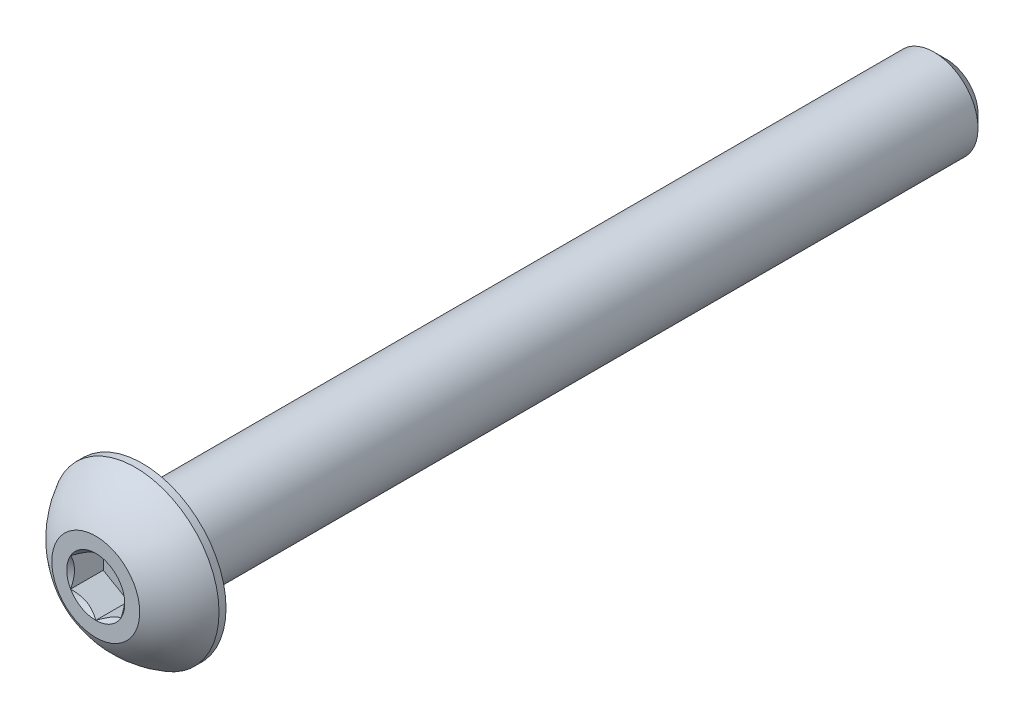
ISO-10303-21;
HEADER;
FILE_DESCRIPTION(('STEP AP214'),'2;1');
FILE_NAME('part.step','',(''),(''),'','','');
FILE_SCHEMA(('AUTOMOTIVE_DESIGN { 1 0 10303 214 1 1 1 1 }'));
ENDSEC;
DATA;
#1=APPLICATION_CONTEXT('core data for automotive mechanical design processes');
#2=APPLICATION_PROTOCOL_DEFINITION('international standard','automotive_design',2000,#1);
#3=PRODUCT_CONTEXT('',#1,'mechanical');
#4=PRODUCT('Part','Part','',(#3));
#5=PRODUCT_RELATED_PRODUCT_CATEGORY('part','',(#4));
#6=PRODUCT_DEFINITION_FORMATION('','',#4);
#7=PRODUCT_DEFINITION_CONTEXT('part definition',#1,'design');
#8=PRODUCT_DEFINITION('design','',#6,#7);
#9=PRODUCT_DEFINITION_SHAPE('','',#8);
#10=(LENGTH_UNIT() NAMED_UNIT(*) SI_UNIT(.MILLI.,.METRE.));
#11=(NAMED_UNIT(*) PLANE_ANGLE_UNIT() SI_UNIT($,.RADIAN.));
#12=(NAMED_UNIT(*) SI_UNIT($,.STERADIAN.) SOLID_ANGLE_UNIT());
#13=UNCERTAINTY_MEASURE_WITH_UNIT(LENGTH_MEASURE(1.E-05),#10,'distance_accuracy_value','');
#14=(GEOMETRIC_REPRESENTATION_CONTEXT(3) GLOBAL_UNCERTAINTY_ASSIGNED_CONTEXT((#13)) GLOBAL_UNIT_ASSIGNED_CONTEXT((#10,
#11,#12)) REPRESENTATION_CONTEXT('',''));
#15=CARTESIAN_POINT('',(0.,0.,0.));
#16=DIRECTION('',(0.,0.,1.));
#17=DIRECTION('',(1.,0.,0.));
#18=AXIS2_PLACEMENT_3D('',#15,#16,#17);
#19=CARTESIAN_POINT('',(0.,-2.0828,-40.3098));
#20=DIRECTION('',(0.,0.,-1.));
#21=DIRECTION('',(0.,1.,0.));
#22=AXIS2_PLACEMENT_3D('',#19,#20,#21);
#23=PLANE('',#22);
#24=CARTESIAN_POINT('',(0.,0.,-40.3098));
#25=DIRECTION('',(0.,0.,-1.));
#26=DIRECTION('',(0.,1.,0.));
#27=AXIS2_PLACEMENT_3D('',#24,#25,#26);
#28=CIRCLE('',#27,1.4874875);
#29=CARTESIAN_POINT('',(0.,1.4874875,-40.3098));
#30=VERTEX_POINT('',#29);
#31=EDGE_CURVE('E176',#30,#30,#28,.T.);
#32=ORIENTED_EDGE('',*,*,#31,.T.);
#33=EDGE_LOOP('',(#32));
#34=FACE_BOUND('',#33,.T.);
#35=ADVANCED_FACE('F37',(#34),#23,.T.);
#36=CARTESIAN_POINT('',(0.,0.,-40.3098));
#37=DIRECTION('',(0.,0.,-1.));
#38=DIRECTION('',(0.,1.,0.));
#39=AXIS2_PLACEMENT_3D('',#36,#37,#38);
#40=CYLINDRICAL_SURFACE('',#39,2.0828);
#41=CARTESIAN_POINT('',(0.,0.,-39.7144875));
#42=DIRECTION('',(0.,0.,-1.));
#43=DIRECTION('',(0.,1.,0.));
#44=AXIS2_PLACEMENT_3D('',#41,#42,#43);
#45=CIRCLE('',#44,2.0828);
#46=CARTESIAN_POINT('',(0.,2.0828,-39.7144875));
#47=VERTEX_POINT('',#46);
#48=EDGE_CURVE('E50',#47,#47,#45,.F.);
#49=ORIENTED_EDGE('',*,*,#48,.T.);
#50=EDGE_LOOP('',(#49));
#51=FACE_BOUND('',#50,.T.);
#52=CARTESIAN_POINT('',(0.,0.,-2.2098));
#53=DIRECTION('',(0.,0.,1.));
#54=DIRECTION('',(1.,0.,0.));
#55=AXIS2_PLACEMENT_3D('',#52,#53,#54);
#56=CIRCLE('',#55,2.0828);
#57=CARTESIAN_POINT('',(2.0828,0.,-2.2098));
#58=VERTEX_POINT('',#57);
#59=EDGE_CURVE('E173',#58,#58,#56,.F.);
#60=ORIENTED_EDGE('',*,*,#59,.T.);
#61=EDGE_LOOP('',(#60));
#62=FACE_BOUND('',#61,.T.);
#63=ADVANCED_FACE('F181',(#51,#62),#40,.T.);
#64=CARTESIAN_POINT('',(0.,0.,-40.3098));
#65=DIRECTION('',(0.,0.,1.));
#66=DIRECTION('',(0.,-1.,0.));
#67=AXIS2_PLACEMENT_3D('',#64,#65,#66);
#68=CONICAL_SURFACE('',#67,1.4874875,0.785398163397444);
#69=ORIENTED_EDGE('',*,*,#48,.F.);
#70=EDGE_LOOP('',(#69));
#71=FACE_BOUND('',#70,.T.);
#72=ORIENTED_EDGE('',*,*,#31,.F.);
#73=EDGE_LOOP('',(#72));
#74=FACE_BOUND('',#73,.T.);
#75=ADVANCED_FACE('F39',(#71,#74),#68,.T.);
#76=CARTESIAN_POINT('',(0.,0.,-3.96380867816092));
#77=DIRECTION('',(0.,0.,1.));
#78=DIRECTION('',(0.,-1.,0.));
#79=AXIS2_PLACEMENT_3D('',#76,#77,#78);
#80=SPHERICAL_SURFACE('',#79,4.47770421947049);
#81=CARTESIAN_POINT('',(0.,0.,0.));
#82=DIRECTION('',(0.,0.,1.));
#83=DIRECTION('',(1.,0.,0.));
#84=AXIS2_PLACEMENT_3D('',#81,#82,#83);
#85=CIRCLE('',#84,2.0828);
#86=CARTESIAN_POINT('',(0.,-2.0828,0.));
#87=VERTEX_POINT('',#86);
#88=EDGE_CURVE('E170',#87,#87,#85,.T.);
#89=CARTESIAN_POINT('',(0.,0.,-1.87833));
#90=DIRECTION('',(0.,0.,1.));
#91=DIRECTION('',(1.,0.,0.));
#92=AXIS2_PLACEMENT_3D('',#89,#90,#91);
#93=CIRCLE('',#92,3.9624);
#94=CARTESIAN_POINT('',(0.,-3.9624,-1.87833));
#95=VERTEX_POINT('',#94);
#96=EDGE_CURVE('E164',#95,#95,#93,.T.);
#97=CARTESIAN_POINT('',(0.,-2.0828,0.));
#98=CARTESIAN_POINT('',(0.,-2.10767763915469,-0.0130720224519118));
#99=CARTESIAN_POINT('',(0.,-2.13243218251379,-0.0263783080421214));
#100=CARTESIAN_POINT('',(0.,-2.18168637330346,-0.0534545587178047));
#101=CARTESIAN_POINT('',(0.,-2.20618602073402,-0.0672245238032785));
#102=CARTESIAN_POINT('',(0.,-2.25492171532922,-0.0952232866881573));
#103=CARTESIAN_POINT('',(0.,-2.27915776249386,-0.109452084487562));
#104=CARTESIAN_POINT('',(0.,-2.32735766987977,-0.138363459316015));
#105=CARTESIAN_POINT('',(0.,-2.35132153010104,-0.153046036345062));
#106=CARTESIAN_POINT('',(0.,-2.39896856692664,-0.18285976708332));
#107=CARTESIAN_POINT('',(0.,-2.42265174353097,-0.197990920792531));
#108=CARTESIAN_POINT('',(0.,-2.46972901769116,-0.22869644015681));
#109=CARTESIAN_POINT('',(0.,-2.49312311524702,-0.244270805811878));
#110=CARTESIAN_POINT('',(0.,-2.53961393789287,-0.275857228060144));
#111=CARTESIAN_POINT('',(0.,-2.56271066298285,-0.291869284653343));
#112=CARTESIAN_POINT('',(0.,-2.60859855282429,-0.324325412379582));
#113=CARTESIAN_POINT('',(0.,-2.63138971757574,-0.340769483512622));
#114=CARTESIAN_POINT('',(0.,-2.67665840715661,-0.37408381082988));
#115=CARTESIAN_POINT('',(0.,-2.69913593198603,-0.390954067014097));
#116=CARTESIAN_POINT('',(0.,-2.74376937333514,-0.425114783844113));
#117=CARTESIAN_POINT('',(0.,-2.76592528985483,-0.442405244489911));
#118=CARTESIAN_POINT('',(0.,-2.80990766020607,-0.477400240693378));
#119=CARTESIAN_POINT('',(0.,-2.83173411403762,-0.495104776251046));
#120=CARTESIAN_POINT('',(0.,-2.8750498214309,-0.530921645935844));
#121=CARTESIAN_POINT('',(0.,-2.89653907499262,-0.549033980062974));
#122=CARTESIAN_POINT('',(0.,-2.93917276380349,-0.585660025978065));
#123=CARTESIAN_POINT('',(0.,-2.96031719905264,-0.604173737766026));
#124=CARTESIAN_POINT('',(0.,-3.00225375543539,-0.641595975803774));
#125=CARTESIAN_POINT('',(0.,-3.02304587656898,-0.66050450205356));
#126=CARTESIAN_POINT('',(0.,-3.06427043381468,-0.698709665852367));
#127=CARTESIAN_POINT('',(0.,-3.08470286992677,-0.718006303401387));
#128=CARTESIAN_POINT('',(0.,-3.12520081373355,-0.756980849048763));
#129=CARTESIAN_POINT('',(0.,-3.14526632142825,-0.776658757147117));
#130=CARTESIAN_POINT('',(0.,-3.1850232950822,-0.816388867981036));
#131=CARTESIAN_POINT('',(0.,-3.20471476104147,-0.836441070716601));
#132=CARTESIAN_POINT('',(0.,-3.24371667050612,-0.876912662223586));
#133=CARTESIAN_POINT('',(0.,-3.2630271140115,-0.897332050995006));
#134=CARTESIAN_POINT('',(0.,-3.30126013292422,-0.938530775803146));
#135=CARTESIAN_POINT('',(0.,-3.32018270833155,-0.959310111839867));
#136=CARTESIAN_POINT('',(0.,-3.35763328290506,-1.00122136480503));
#137=CARTESIAN_POINT('',(0.,-3.37616128207125,-1.02235328173348));
#138=CARTESIAN_POINT('',(0.,-3.41281613589854,-1.06496220511693));
#139=CARTESIAN_POINT('',(0.,-3.43094299055964,-1.08643921157194));
#140=CARTESIAN_POINT('',(0.,-3.46678912932052,-1.12973070030741));
#141=CARTESIAN_POINT('',(0.,-3.4845084134203,-1.15154518258787));
#142=CARTESIAN_POINT('',(0.,-3.51953312948771,-1.19550388963656));
#143=CARTESIAN_POINT('',(0.,-3.53683856145534,-1.21764811440477));
#144=CARTESIAN_POINT('',(0.,-3.57102943840132,-1.26225845619532));
#145=CARTESIAN_POINT('',(0.,-3.58791488337967,-1.28472457321766));
#146=CARTESIAN_POINT('',(0.,-3.62125980037301,-1.32997073517287));
#147=CARTESIAN_POINT('',(0.,-3.637719272388,-1.35275078010575));
#148=CARTESIAN_POINT('',(0.,-3.67020640850626,-1.39861672224058));
#149=CARTESIAN_POINT('',(0.,-3.68623407260953,-1.42170261944253));
#150=CARTESIAN_POINT('',(0.,-3.71785191097313,-1.46817208208141));
#151=CARTESIAN_POINT('',(0.,-3.73344208523347,-1.49155564751835));
#152=CARTESIAN_POINT('',(0.,-3.76417941729919,-1.53861215694335));
#153=CARTESIAN_POINT('',(0.,-3.77932657510458,-1.56228510093141));
#154=CARTESIAN_POINT('',(0.,-3.80917250385283,-1.60991197565512));
#155=CARTESIAN_POINT('',(0.,-3.82387127479568,-1.63386590639077));
#156=CARTESIAN_POINT('',(0.,-3.85281522152763,-1.68204626145442));
#157=CARTESIAN_POINT('',(0.,-3.86706039731673,-1.70627268578243));
#158=CARTESIAN_POINT('',(0.,-3.89509209445425,-1.754989444771));
#159=CARTESIAN_POINT('',(0.,-3.90887861580268,-1.77947977943156));
#160=CARTESIAN_POINT('',(0.,-3.93598815139536,-1.8287156580258));
#161=CARTESIAN_POINT('',(0.,-3.94931116563961,-1.85346120195948));
#162=CARTESIAN_POINT('',(0.,-3.9624,-1.87833));
#163=B_SPLINE_CURVE_WITH_KNOTS('',3,(#97,#98,#99,#100,#101,#102,#103,#104,#105,#106,#107,#108,
#109,#110,#111,#112,#113,#114,#115,#116,#117,#118,#119,#120,#121,#122,#123,#124,#125,#126,#127,
#128,#129,#130,#131,#132,#133,#134,#135,#136,#137,#138,#139,#140,#141,#142,#143,#144,#145,#146,
#147,#148,#149,#150,#151,#152,#153,#154,#155,#156,#157,#158,#159,#160,#161,#162),.UNSPECIFIED.,
.F.,.F.,(4,2,2,2,2,2,2,2,2,2,2,2,2,2,2,2,2,2,2,2,2,2,2,2,2,2,2,2,2,2,2,2,4),(0.,
0.0843075442014962,0.168615088402992,0.252922632604488,0.337230176805985,0.421537721007481,
0.505845265208977,0.590152809410473,0.674460353611969,0.758767897813466,0.843075442014961,
0.927382986216458,1.01169053041795,1.09599807461945,1.18030561882095,1.26461316302244,
1.34892070722394,1.43322825142543,1.51753579562693,1.60184333982843,1.68615088402992,
1.77045842823142,1.85476597243292,1.93907351663441,2.02338106083591,2.1076886050374,
2.1919961492389,2.2763036934404,2.36061123764189,2.44491878184339,2.52922632604488,
2.61353387024638,2.69784141444788),.UNSPECIFIED.);
#164=EDGE_CURVE('BSEAM186',#87,#95,#163,.T.);
#165=ORIENTED_EDGE('',*,*,#88,.F.);
#166=ORIENTED_EDGE('',*,*,#96,.T.);
#167=ORIENTED_EDGE('',*,*,#164,.T.);
#168=ORIENTED_EDGE('',*,*,#164,.F.);
#169=EDGE_LOOP('',(#165,#167,#166,#168));
#170=FACE_BOUND('',#169,.T.);
#171=ADVANCED_FACE('F186',(#170),#80,.T.);
#172=CARTESIAN_POINT('',(0.,-2.0828,0.));
#173=DIRECTION('',(0.,0.,-1.));
#174=DIRECTION('',(-1.,0.,0.));
#175=AXIS2_PLACEMENT_3D('',#172,#173,#174);
#176=PLANE('',#175);
#177=CARTESIAN_POINT('',(0.,0.,0.));
#178=DIRECTION('',(0.,0.,1.));
#179=DIRECTION('',(1.,0.,0.));
#180=AXIS2_PLACEMENT_3D('',#177,#178,#179);
#181=CIRCLE('',#180,1.3748153285078);
#182=CARTESIAN_POINT('',(-1.190625,0.687407664253898,0.));
#183=VERTEX_POINT('',#182);
#184=CARTESIAN_POINT('',(-1.190625,-0.687407664253899,0.));
#185=VERTEX_POINT('',#184);
#186=EDGE_CURVE('E63',#183,#185,#181,.T.);
#187=ORIENTED_EDGE('',*,*,#186,.F.);
#188=CARTESIAN_POINT('',(0.,1.3748153285078,0.));
#189=VERTEX_POINT('',#188);
#190=EDGE_CURVE('E135',#189,#183,#181,.T.);
#191=ORIENTED_EDGE('',*,*,#190,.F.);
#192=CARTESIAN_POINT('',(1.190625,0.687407664253899,0.));
#193=VERTEX_POINT('',#192);
#194=EDGE_CURVE('E132',#193,#189,#181,.T.);
#195=ORIENTED_EDGE('',*,*,#194,.F.);
#196=CARTESIAN_POINT('',(1.190625,-0.687407664253899,0.));
#197=VERTEX_POINT('',#196);
#198=EDGE_CURVE('E103',#197,#193,#181,.T.);
#199=ORIENTED_EDGE('',*,*,#198,.F.);
#200=CARTESIAN_POINT('',(0.,-1.3748153285078,0.));
#201=VERTEX_POINT('',#200);
#202=EDGE_CURVE('E95',#201,#197,#181,.T.);
#203=ORIENTED_EDGE('',*,*,#202,.F.);
#204=EDGE_CURVE('E56',#185,#201,#181,.T.);
#205=ORIENTED_EDGE('',*,*,#204,.F.);
#206=EDGE_LOOP('',(#187,#191,#195,#199,#203,#205));
#207=FACE_BOUND('',#206,.T.);
#208=ORIENTED_EDGE('',*,*,#88,.T.);
#209=EDGE_LOOP('',(#208));
#210=FACE_BOUND('',#209,.T.);
#211=ADVANCED_FACE('F129',(#207,#210),#176,.F.);
#212=CARTESIAN_POINT('',(0.,-3.9624,-2.2098));
#213=DIRECTION('',(0.,0.,1.));
#214=DIRECTION('',(1.,0.,0.));
#215=AXIS2_PLACEMENT_3D('',#212,#213,#214);
#216=PLANE('',#215);
#217=ORIENTED_EDGE('',*,*,#59,.F.);
#218=EDGE_LOOP('',(#217));
#219=FACE_BOUND('',#218,.T.);
#220=CARTESIAN_POINT('',(0.,0.,-2.2098));
#221=DIRECTION('',(0.,0.,1.));
#222=DIRECTION('',(1.,0.,0.));
#223=AXIS2_PLACEMENT_3D('',#220,#221,#222);
#224=CIRCLE('',#223,3.9624);
#225=CARTESIAN_POINT('',(3.9624,0.,-2.2098));
#226=VERTEX_POINT('',#225);
#227=EDGE_CURVE('E167',#226,#226,#224,.T.);
#228=ORIENTED_EDGE('',*,*,#227,.F.);
#229=EDGE_LOOP('',(#228));
#230=FACE_BOUND('',#229,.T.);
#231=ADVANCED_FACE('F200',(#219,#230),#216,.F.);
#232=CARTESIAN_POINT('',(0.,0.,0.));
#233=DIRECTION('',(0.,0.,1.));
#234=DIRECTION('',(1.,0.,0.));
#235=AXIS2_PLACEMENT_3D('',#232,#233,#234);
#236=CYLINDRICAL_SURFACE('',#235,3.9624);
#237=ORIENTED_EDGE('',*,*,#96,.F.);
#238=EDGE_LOOP('',(#237));
#239=FACE_BOUND('',#238,.T.);
#240=ORIENTED_EDGE('',*,*,#227,.T.);
#241=EDGE_LOOP('',(#240));
#242=FACE_BOUND('',#241,.T.);
#243=ADVANCED_FACE('F203',(#239,#242),#236,.T.);
#244=CARTESIAN_POINT('',(0.,0.,0.));
#245=DIRECTION('',(0.,0.,1.));
#246=DIRECTION('',(1.,0.,0.));
#247=AXIS2_PLACEMENT_3D('',#244,#245,#246);
#248=CONICAL_SURFACE('',#247,1.3748153285078,0.78539816339745);
#249=ORIENTED_EDGE('',*,*,#198,.T.);
#250=CARTESIAN_POINT('',(1.190625,-1.37097145294693,0.44099044728994));
#251=CARTESIAN_POINT('',(1.190625,-1.3375892063789,0.415789988807826));
#252=CARTESIAN_POINT('',(1.190625,-1.30402095496658,0.39083662023745));
#253=CARTESIAN_POINT('',(1.190625,-1.23643692297761,0.341526087177203));
#254=CARTESIAN_POINT('',(1.190625,-1.20242103219112,0.317169073899369));
#255=CARTESIAN_POINT('',(1.190625,-1.09909081482554,0.244798208989214));
#256=CARTESIAN_POINT('',(1.190625,-1.02900143506767,0.197872622595561));
#257=CARTESIAN_POINT('',(1.190625,-0.882026737424228,0.105752103325632));
#258=CARTESIAN_POINT('',(1.190625,-0.80498186601998,0.0608088372420604));
#259=CARTESIAN_POINT('',(1.190625,-0.647043893307964,-0.0214019754931318));
#260=CARTESIAN_POINT('',(1.190625,-0.56616494370292,-0.058695398267878));
#261=CARTESIAN_POINT('',(1.190625,-0.444764933868855,-0.104320444436902));
#262=CARTESIAN_POINT('',(1.190625,-0.406041211486712,-0.117415160978515));
#263=CARTESIAN_POINT('',(1.190625,-0.327658904711932,-0.140495724103359));
#264=CARTESIAN_POINT('',(1.190625,-0.288000256118251,-0.150481356514043));
#265=CARTESIAN_POINT('',(1.190625,-0.208647693212096,-0.166658770934747));
#266=CARTESIAN_POINT('',(1.190625,-0.168967240621961,-0.172915554151022));
#267=CARTESIAN_POINT('',(1.190625,-0.0891819742965327,-0.181513111581485));
#268=CARTESIAN_POINT('',(1.190625,-0.0490772347013119,-0.183854558950103));
#269=CARTESIAN_POINT('',(1.190625,0.0297075773931769,-0.184447755932347));
#270=CARTESIAN_POINT('',(1.190625,0.068386606828809,-0.182844646203951));
#271=CARTESIAN_POINT('',(1.190625,0.14541687663315,-0.175956972255488));
#272=CARTESIAN_POINT('',(1.190625,0.183768052740679,-0.170671702331516));
#273=CARTESIAN_POINT('',(1.190625,0.260508634904944,-0.156618587767133));
#274=CARTESIAN_POINT('',(1.190625,0.298887052039132,-0.14779163739419));
#275=CARTESIAN_POINT('',(1.190625,0.374805334250663,-0.127124290019378));
#276=CARTESIAN_POINT('',(1.190625,0.412345269207094,-0.115284145164061));
#277=CARTESIAN_POINT('',(1.190625,0.530535580908839,-0.0735526663328066));
#278=CARTESIAN_POINT('',(1.190625,0.609503725744447,-0.0389086030856526));
#279=CARTESIAN_POINT('',(1.190625,0.763730269113466,0.0381182519748632));
#280=CARTESIAN_POINT('',(1.190625,0.838974064674605,0.0805288466686658));
#281=CARTESIAN_POINT('',(1.190625,0.982775796189618,0.168025645024959));
#282=CARTESIAN_POINT('',(1.190625,1.05148016607044,0.212874162055227));
#283=CARTESIAN_POINT('',(1.190625,1.15270222256253,0.282205329922607));
#284=CARTESIAN_POINT('',(1.190625,1.18600604145834,0.305560176337173));
#285=CARTESIAN_POINT('',(1.190625,1.25215860362232,0.35288756901931));
#286=CARTESIAN_POINT('',(1.190625,1.28500746868279,0.376859944858282));
#287=CARTESIAN_POINT('',(1.190625,1.31766689427973,0.401088366771255));
#288=B_SPLINE_CURVE_WITH_KNOTS('',3,(#250,#251,#252,#253,#254,#255,#256,#257,#258,#259,#260,
#261,#262,#263,#264,#265,#266,#267,#268,#269,#270,#271,#272,#273,#274,#275,#276,#277,#278,#279,
#280,#281,#282,#283,#284,#285,#286,#287),.UNSPECIFIED.,.F.,.F.,(4,2,2,2,2,2,2,2,2,2,2,2,2,2,2,2,
2,2,4),(0.,0.125475644763329,0.250982782413966,0.503912518769173,0.771279184643224,
1.03772598255657,1.16025581644629,1.28279408906665,1.40312855503246,1.5234423300503,
1.63939577664877,1.75537145240477,1.87336894094838,1.99135655861152,2.24929724983449,
2.50818004711563,2.75419821472196,2.87622362118596,2.99821570388961),.UNSPECIFIED.);
#289=EDGE_CURVE('E11',#197,#193,#288,.T.);
#290=ORIENTED_EDGE('',*,*,#289,.F.);
#291=EDGE_LOOP('',(#249,#290));
#292=FACE_BOUND('',#291,.T.);
#293=ADVANCED_FACE('F107',(#292),#248,.F.);
#294=ORIENTED_EDGE('',*,*,#194,.T.);
#295=CARTESIAN_POINT('',(1.190825,0.68729219420006,0.000115484600023907));
#296=CARTESIAN_POINT('',(1.14989058041014,0.710925692369385,-0.0235012357857369));
#297=CARTESIAN_POINT('',(1.10827161169803,0.734954415158721,-0.0457312182768795));
#298=CARTESIAN_POINT('',(1.02340555632637,0.783951855072609,-0.0864343373725631));
#299=CARTESIAN_POINT('',(0.980150392709039,0.808925235430915,-0.104884817352449));
#300=CARTESIAN_POINT('',(0.892928352542576,0.859282903800291,-0.136491161995679));
#301=CARTESIAN_POINT('',(0.848983705042075,0.884654357864149,-0.149726495756684));
#302=CARTESIAN_POINT('',(0.760126625836306,0.935956016463003,-0.170118548424605));
#303=CARTESIAN_POINT('',(0.715216911165245,0.96188465231757,-0.177290497104008));
#304=CARTESIAN_POINT('',(0.637820872343022,1.00656927616579,-0.183761461351144));
#305=CARTESIAN_POINT('',(0.605434587484353,1.025267506447,-0.18471967985321));
#306=CARTESIAN_POINT('',(0.54071892668223,1.06263111063189,-0.183107350927916));
#307=CARTESIAN_POINT('',(0.508389564872727,1.08129647637533,-0.180536024820421));
#308=CARTESIAN_POINT('',(0.444042843928515,1.11844707303394,-0.172013246006379));
#309=CARTESIAN_POINT('',(0.412025803663232,1.13693211984976,-0.166058645247436));
#310=CARTESIAN_POINT('',(0.348526236603543,1.17359361198509,-0.1510900359288));
#311=CARTESIAN_POINT('',(0.317043945355836,1.19176992131166,-0.142074714087946));
#312=CARTESIAN_POINT('',(0.236410161427873,1.23832385816825,-0.115317704161983));
#313=CARTESIAN_POINT('',(0.187767164732342,1.26640790540461,-0.0955631855639916));
#314=CARTESIAN_POINT('',(0.0923855836478807,1.32147648691945,-0.0510632310423197));
#315=CARTESIAN_POINT('',(0.0456413824128441,1.34846426408555,-0.026334035283841));
#316=CARTESIAN_POINT('',(-0.000200000000000358,1.37493079856163,0.000115484600024344));
#317=B_SPLINE_CURVE_WITH_KNOTS('',3,(#295,#296,#297,#298,#299,#300,#301,#302,#303,#304,#305,
#306,#307,#308,#309,#310,#311,#312,#313,#314,#315,#316),.UNSPECIFIED.,.F.,.F.,(4,2,2,2,2,2,2,2,
2,2,4),(0.,0.15862567293412,0.318176079843271,0.475191357500655,0.631811068630749,
0.743878551794718,0.855970763007029,0.968167444423242,1.08041232768377,1.25873351645467,
1.43648174479847),.UNSPECIFIED.);
#318=EDGE_CURVE('E134',#193,#189,#317,.T.);
#319=ORIENTED_EDGE('',*,*,#318,.F.);
#320=EDGE_LOOP('',(#294,#319));
#321=FACE_BOUND('',#320,.T.);
#322=ADVANCED_FACE('F283',(#321),#248,.F.);
#323=ORIENTED_EDGE('',*,*,#190,.T.);
#324=CARTESIAN_POINT('',(0.000199999999999495,1.37493079856163,0.000115484600024211));
#325=CARTESIAN_POINT('',(-0.0407344195898567,1.35129730039231,-0.0235012357857363));
#326=CARTESIAN_POINT('',(-0.0823533883019742,1.32726857760297,-0.045731218276879));
#327=CARTESIAN_POINT('',(-0.167219443673633,1.27827113768909,-0.0864343373725627));
#328=CARTESIAN_POINT('',(-0.210474607290961,1.25329775733078,-0.104884817352448));
#329=CARTESIAN_POINT('',(-0.297696647457424,1.2029400889614,-0.136491161995679));
#330=CARTESIAN_POINT('',(-0.341641294957925,1.17756863489755,-0.149726495756683));
#331=CARTESIAN_POINT('',(-0.430498374163694,1.12626697629869,-0.170118548424605));
#332=CARTESIAN_POINT('',(-0.475408088834755,1.10033834044413,-0.177290497104008));
#333=CARTESIAN_POINT('',(-0.552804127656978,1.0556537165959,-0.183761461351144));
#334=CARTESIAN_POINT('',(-0.585190412515646,1.0369554863147,-0.18471967985321));
#335=CARTESIAN_POINT('',(-0.64990607331777,0.99959188212981,-0.183107350927916));
#336=CARTESIAN_POINT('',(-0.682235435127272,0.980926516386364,-0.180536024820421));
#337=CARTESIAN_POINT('',(-0.746582156071484,0.943775919727754,-0.172013246006379));
#338=CARTESIAN_POINT('',(-0.778599196336768,0.925290872911937,-0.166058645247436));
#339=CARTESIAN_POINT('',(-0.842098763396457,0.888629380776601,-0.1510900359288));
#340=CARTESIAN_POINT('',(-0.873581054644164,0.870453071450031,-0.142074714087946));
#341=CARTESIAN_POINT('',(-0.954214838572126,0.823899134593444,-0.115317704161984));
#342=CARTESIAN_POINT('',(-1.00285783526766,0.795815087357089,-0.0955631855639919));
#343=CARTESIAN_POINT('',(-1.09823941635212,0.740746505842243,-0.0510632310423202));
#344=CARTESIAN_POINT('',(-1.14498361758716,0.713758728676141,-0.0263340352838417));
#345=CARTESIAN_POINT('',(-1.190825,0.68729219420006,0.000115484600023614));
#346=B_SPLINE_CURVE_WITH_KNOTS('',3,(#324,#325,#326,#327,#328,#329,#330,#331,#332,#333,#334,
#335,#336,#337,#338,#339,#340,#341,#342,#343,#344,#345),.UNSPECIFIED.,.F.,.F.,(4,2,2,2,2,2,2,2,
2,2,4),(0.,0.15862567293412,0.318176079843271,0.475191357500655,0.631811068630748,
0.743878551794718,0.855970763007028,0.968167444423241,1.08041232768376,1.25873351645467,
1.43648174479847),.UNSPECIFIED.);
#347=EDGE_CURVE('E139',#189,#183,#346,.T.);
#348=ORIENTED_EDGE('',*,*,#347,.F.);
#349=EDGE_LOOP('',(#323,#348));
#350=FACE_BOUND('',#349,.T.);
#351=ADVANCED_FACE('F142',(#350),#248,.F.);
#352=ORIENTED_EDGE('',*,*,#186,.T.);
#353=CARTESIAN_POINT('',(-1.190625,-1.37097145294693,0.440990447289941));
#354=CARTESIAN_POINT('',(-1.190625,-1.3375892063789,0.415789988807826));
#355=CARTESIAN_POINT('',(-1.190625,-1.30402095496658,0.39083662023745));
#356=CARTESIAN_POINT('',(-1.190625,-1.23643692297761,0.341526087177203));
#357=CARTESIAN_POINT('',(-1.190625,-1.20242103219112,0.317169073899369));
#358=CARTESIAN_POINT('',(-1.190625,-1.09909081482554,0.244798208989214));
#359=CARTESIAN_POINT('',(-1.190625,-1.02900143506767,0.197872622595562));
#360=CARTESIAN_POINT('',(-1.190625,-0.882026737424229,0.105752103325632));
#361=CARTESIAN_POINT('',(-1.190625,-0.80498186601998,0.0608088372420604));
#362=CARTESIAN_POINT('',(-1.190625,-0.647043893307964,-0.0214019754931318));
#363=CARTESIAN_POINT('',(-1.190625,-0.56616494370292,-0.0586953982678779));
#364=CARTESIAN_POINT('',(-1.190625,-0.444764933868855,-0.104320444436902));
#365=CARTESIAN_POINT('',(-1.190625,-0.406041211486713,-0.117415160978515));
#366=CARTESIAN_POINT('',(-1.190625,-0.327658904711932,-0.140495724103359));
#367=CARTESIAN_POINT('',(-1.190625,-0.288000256118252,-0.150481356514043));
#368=CARTESIAN_POINT('',(-1.190625,-0.208647693212096,-0.166658770934748));
#369=CARTESIAN_POINT('',(-1.190625,-0.168967240621961,-0.172915554151022));
#370=CARTESIAN_POINT('',(-1.190625,-0.0891819742965331,-0.181513111581485));
#371=CARTESIAN_POINT('',(-1.190625,-0.0490772347013122,-0.183854558950103));
#372=CARTESIAN_POINT('',(-1.190625,0.0297075773931766,-0.184447755932347));
#373=CARTESIAN_POINT('',(-1.190625,0.0683866068288087,-0.182844646203951));
#374=CARTESIAN_POINT('',(-1.190625,0.14541687663315,-0.175956972255488));
#375=CARTESIAN_POINT('',(-1.190625,0.183768052740679,-0.170671702331516));
#376=CARTESIAN_POINT('',(-1.190625,0.260508634904944,-0.156618587767133));
#377=CARTESIAN_POINT('',(-1.190625,0.298887052039132,-0.147791637394191));
#378=CARTESIAN_POINT('',(-1.190625,0.374805334250663,-0.127124290019378));
#379=CARTESIAN_POINT('',(-1.190625,0.412345269207094,-0.115284145164062));
#380=CARTESIAN_POINT('',(-1.190625,0.530535580908839,-0.0735526663328068));
#381=CARTESIAN_POINT('',(-1.190625,0.609503725744447,-0.0389086030856529));
#382=CARTESIAN_POINT('',(-1.190625,0.763730269113466,0.0381182519748631));
#383=CARTESIAN_POINT('',(-1.190625,0.838974064674605,0.0805288466686658));
#384=CARTESIAN_POINT('',(-1.190625,0.982775796189618,0.168025645024959));
#385=CARTESIAN_POINT('',(-1.190625,1.05148016607044,0.212874162055227));
#386=CARTESIAN_POINT('',(-1.190625,1.15270222256253,0.282205329922607));
#387=CARTESIAN_POINT('',(-1.190625,1.18600604145834,0.305560176337173));
#388=CARTESIAN_POINT('',(-1.190625,1.25215860362232,0.35288756901931));
#389=CARTESIAN_POINT('',(-1.190625,1.28500746868279,0.376859944858282));
#390=CARTESIAN_POINT('',(-1.190625,1.31766689427973,0.401088366771255));
#391=B_SPLINE_CURVE_WITH_KNOTS('',3,(#353,#354,#355,#356,#357,#358,#359,#360,#361,#362,#363,
#364,#365,#366,#367,#368,#369,#370,#371,#372,#373,#374,#375,#376,#377,#378,#379,#380,#381,#382,
#383,#384,#385,#386,#387,#388,#389,#390),.UNSPECIFIED.,.F.,.F.,(4,2,2,2,2,2,2,2,2,2,2,2,2,2,2,2,
2,2,4),(0.,0.125475644763329,0.250982782413966,0.503912518769173,0.771279184643224,
1.03772598255657,1.16025581644629,1.28279408906665,1.40312855503246,1.5234423300503,
1.63939577664877,1.75537145240477,1.87336894094838,1.99135655861152,2.24929724983449,
2.50818004711563,2.75419821472196,2.87622362118597,2.99821570388961),.UNSPECIFIED.);
#392=EDGE_CURVE('E146',#183,#185,#391,.F.);
#393=ORIENTED_EDGE('',*,*,#392,.F.);
#394=EDGE_LOOP('',(#352,#393));
#395=FACE_BOUND('',#394,.T.);
#396=ADVANCED_FACE('F277',(#395),#248,.F.);
#397=ORIENTED_EDGE('',*,*,#204,.T.);
#398=CARTESIAN_POINT('',(-1.190825,-0.687292194200061,0.000115484600023906));
#399=CARTESIAN_POINT('',(-1.14989058041014,-0.710925692369385,-0.0235012357857368));
#400=CARTESIAN_POINT('',(-1.10827161169803,-0.734954415158721,-0.0457312182768794));
#401=CARTESIAN_POINT('',(-1.02340555632637,-0.783951855072609,-0.086434337372563));
#402=CARTESIAN_POINT('',(-0.980150392709039,-0.808925235430915,-0.104884817352449));
#403=CARTESIAN_POINT('',(-0.892928352542576,-0.859282903800291,-0.136491161995679));
#404=CARTESIAN_POINT('',(-0.848983705042075,-0.884654357864149,-0.149726495756684));
#405=CARTESIAN_POINT('',(-0.760126625836306,-0.935956016463003,-0.170118548424605));
#406=CARTESIAN_POINT('',(-0.715216911165245,-0.961884652317569,-0.177290497104008));
#407=CARTESIAN_POINT('',(-0.637820872343022,-1.00656927616579,-0.183761461351144));
#408=CARTESIAN_POINT('',(-0.605434587484353,-1.02526750644699,-0.18471967985321));
#409=CARTESIAN_POINT('',(-0.54071892668223,-1.06263111063189,-0.183107350927916));
#410=CARTESIAN_POINT('',(-0.508389564872727,-1.08129647637533,-0.180536024820421));
#411=CARTESIAN_POINT('',(-0.444042843928515,-1.11844707303394,-0.172013246006379));
#412=CARTESIAN_POINT('',(-0.412025803663232,-1.13693211984976,-0.166058645247436));
#413=CARTESIAN_POINT('',(-0.348526236603543,-1.17359361198509,-0.1510900359288));
#414=CARTESIAN_POINT('',(-0.317043945355836,-1.19176992131166,-0.142074714087946));
#415=CARTESIAN_POINT('',(-0.236410161427873,-1.23832385816825,-0.115317704161983));
#416=CARTESIAN_POINT('',(-0.187767164732342,-1.26640790540461,-0.0955631855639916));
#417=CARTESIAN_POINT('',(-0.0923855836478808,-1.32147648691945,-0.0510632310423198));
#418=CARTESIAN_POINT('',(-0.0456413824128442,-1.34846426408555,-0.0263340352838412));
#419=CARTESIAN_POINT('',(0.000200000000000431,-1.37493079856163,0.000115484600024223));
#420=B_SPLINE_CURVE_WITH_KNOTS('',3,(#398,#399,#400,#401,#402,#403,#404,#405,#406,#407,#408,
#409,#410,#411,#412,#413,#414,#415,#416,#417,#418,#419),.UNSPECIFIED.,.F.,.F.,(4,2,2,2,2,2,2,2,
2,2,4),(0.,0.15862567293412,0.318176079843271,0.475191357500655,0.631811068630748,
0.743878551794718,0.855970763007029,0.968167444423241,1.08041232768377,1.25873351645467,
1.43648174479847),.UNSPECIFIED.);
#421=EDGE_CURVE('E119',#185,#201,#420,.T.);
#422=ORIENTED_EDGE('',*,*,#421,.F.);
#423=EDGE_LOOP('',(#397,#422));
#424=FACE_BOUND('',#423,.T.);
#425=ADVANCED_FACE('F228',(#424),#248,.F.);
#426=ORIENTED_EDGE('',*,*,#202,.T.);
#427=CARTESIAN_POINT('',(-0.000199999999999412,-1.37493079856163,0.000115484600024211));
#428=CARTESIAN_POINT('',(0.0407344195898569,-1.35129730039231,-0.0235012357857364));
#429=CARTESIAN_POINT('',(0.0823533883019744,-1.32726857760297,-0.045731218276879));
#430=CARTESIAN_POINT('',(0.167219443673633,-1.27827113768909,-0.0864343373725627));
#431=CARTESIAN_POINT('',(0.210474607290961,-1.25329775733078,-0.104884817352448));
#432=CARTESIAN_POINT('',(0.297696647457424,-1.2029400889614,-0.136491161995679));
#433=CARTESIAN_POINT('',(0.341641294957925,-1.17756863489755,-0.149726495756684));
#434=CARTESIAN_POINT('',(0.430498374163694,-1.12626697629869,-0.170118548424605));
#435=CARTESIAN_POINT('',(0.475408088834755,-1.10033834044413,-0.177290497104008));
#436=CARTESIAN_POINT('',(0.552804127656978,-1.0556537165959,-0.183761461351144));
#437=CARTESIAN_POINT('',(0.585190412515647,-1.0369554863147,-0.18471967985321));
#438=CARTESIAN_POINT('',(0.64990607331777,-0.99959188212981,-0.183107350927916));
#439=CARTESIAN_POINT('',(0.682235435127273,-0.980926516386364,-0.180536024820421));
#440=CARTESIAN_POINT('',(0.746582156071485,-0.943775919727753,-0.172013246006379));
#441=CARTESIAN_POINT('',(0.778599196336768,-0.925290872911937,-0.166058645247436));
#442=CARTESIAN_POINT('',(0.842098763396457,-0.888629380776601,-0.1510900359288));
#443=CARTESIAN_POINT('',(0.873581054644164,-0.870453071450031,-0.142074714087946));
#444=CARTESIAN_POINT('',(0.954214838572127,-0.823899134593444,-0.115317704161983));
#445=CARTESIAN_POINT('',(1.00285783526766,-0.795815087357089,-0.0955631855639918));
#446=CARTESIAN_POINT('',(1.09823941635212,-0.740746505842243,-0.0510632310423199));
#447=CARTESIAN_POINT('',(1.14498361758716,-0.713758728676141,-0.0263340352838413));
#448=CARTESIAN_POINT('',(1.190825,-0.68729219420006,0.00011548460002403));
#449=B_SPLINE_CURVE_WITH_KNOTS('',3,(#427,#428,#429,#430,#431,#432,#433,#434,#435,#436,#437,
#438,#439,#440,#441,#442,#443,#444,#445,#446,#447,#448),.UNSPECIFIED.,.F.,.F.,(4,2,2,2,2,2,2,2,
2,2,4),(0.,0.15862567293412,0.318176079843271,0.475191357500655,0.631811068630748,
0.743878551794718,0.855970763007029,0.968167444423242,1.08041232768377,1.25873351645467,
1.43648174479847),.UNSPECIFIED.);
#450=EDGE_CURVE('E99',#201,#197,#449,.T.);
#451=ORIENTED_EDGE('',*,*,#450,.F.);
#452=EDGE_LOOP('',(#426,#451));
#453=FACE_BOUND('',#452,.T.);
#454=ADVANCED_FACE('F97',(#453),#248,.F.);
#455=CARTESIAN_POINT('',(1.190625,-0.687407664253898,-1.54686));
#456=DIRECTION('',(0.,0.,1.));
#457=DIRECTION('',(1.,0.,0.));
#458=AXIS2_PLACEMENT_3D('',#455,#456,#457);
#459=PLANE('',#458);
#460=DIRECTION('',(0.866025403784438,0.5,0.));
#461=VECTOR('',#460,1.);
#462=CARTESIAN_POINT('',(0.,-1.3748153285078,-1.54686));
#463=LINE('',#462,#461);
#464=CARTESIAN_POINT('',(0.,-1.3748153285078,-1.54686));
#465=VERTEX_POINT('',#464);
#466=CARTESIAN_POINT('',(1.190625,-0.687407664253898,-1.54686));
#467=VERTEX_POINT('',#466);
#468=EDGE_CURVE('E118',#465,#467,#463,.T.);
#469=ORIENTED_EDGE('',*,*,#468,.T.);
#470=DIRECTION('',(0.,1.,0.));
#471=VECTOR('',#470,1.);
#472=CARTESIAN_POINT('',(1.190625,-0.687407664253898,-1.54686));
#473=LINE('',#472,#471);
#474=CARTESIAN_POINT('',(1.190625,0.687407664253898,-1.54686));
#475=VERTEX_POINT('',#474);
#476=EDGE_CURVE('E123',#467,#475,#473,.T.);
#477=ORIENTED_EDGE('',*,*,#476,.T.);
#478=DIRECTION('',(-0.866025403784439,0.5,0.));
#479=VECTOR('',#478,1.);
#480=CARTESIAN_POINT('',(1.190625,0.687407664253898,-1.54686));
#481=LINE('',#480,#479);
#482=CARTESIAN_POINT('',(0.,1.3748153285078,-1.54686));
#483=VERTEX_POINT('',#482);
#484=EDGE_CURVE('E267',#475,#483,#481,.T.);
#485=ORIENTED_EDGE('',*,*,#484,.T.);
#486=DIRECTION('',(-0.866025403784438,-0.5,0.));
#487=VECTOR('',#486,1.);
#488=CARTESIAN_POINT('',(0.,1.3748153285078,-1.54686));
#489=LINE('',#488,#487);
#490=CARTESIAN_POINT('',(-1.190625,0.687407664253898,-1.54686));
#491=VERTEX_POINT('',#490);
#492=EDGE_CURVE('E155',#483,#491,#489,.T.);
#493=ORIENTED_EDGE('',*,*,#492,.T.);
#494=DIRECTION('',(0.,-1.,0.));
#495=VECTOR('',#494,1.);
#496=CARTESIAN_POINT('',(-1.190625,0.687407664253898,-1.54686));
#497=LINE('',#496,#495);
#498=CARTESIAN_POINT('',(-1.190625,-0.687407664253898,-1.54686));
#499=VERTEX_POINT('',#498);
#500=EDGE_CURVE('E271',#491,#499,#497,.T.);
#501=ORIENTED_EDGE('',*,*,#500,.T.);
#502=DIRECTION('',(0.866025403784439,-0.5,0.));
#503=VECTOR('',#502,1.);
#504=CARTESIAN_POINT('',(-1.190625,-0.687407664253898,-1.54686));
#505=LINE('',#504,#503);
#506=EDGE_CURVE('E126',#499,#465,#505,.T.);
#507=ORIENTED_EDGE('',*,*,#506,.T.);
#508=EDGE_LOOP('',(#469,#477,#485,#493,#501,#507));
#509=FACE_BOUND('',#508,.T.);
#510=ADVANCED_FACE('F227',(#509),#459,.T.);
#511=CARTESIAN_POINT('',(1.190625,-0.687407664253898,-1.54686));
#512=DIRECTION('',(1.,0.,0.));
#513=DIRECTION('',(0.,0.,-1.));
#514=AXIS2_PLACEMENT_3D('',#511,#512,#513);
#515=PLANE('',#514);
#516=DIRECTION('',(0.,0.,1.));
#517=VECTOR('',#516,1.);
#518=CARTESIAN_POINT('',(1.190625,-0.687407664253898,-1.54686));
#519=LINE('',#518,#517);
#520=EDGE_CURVE('E115',#467,#197,#519,.T.);
#521=ORIENTED_EDGE('',*,*,#520,.T.);
#522=ORIENTED_EDGE('',*,*,#289,.T.);
#523=DIRECTION('',(0.,0.,1.));
#524=VECTOR('',#523,1.);
#525=CARTESIAN_POINT('',(1.190625,0.687407664253898,-1.54686));
#526=LINE('',#525,#524);
#527=EDGE_CURVE('E125',#475,#193,#526,.T.);
#528=ORIENTED_EDGE('',*,*,#527,.F.);
#529=ORIENTED_EDGE('',*,*,#476,.F.);
#530=EDGE_LOOP('',(#521,#522,#528,#529));
#531=FACE_BOUND('',#530,.T.);
#532=ADVANCED_FACE('F121',(#531),#515,.F.);
#533=CARTESIAN_POINT('',(1.190625,0.687407664253898,-1.54686));
#534=DIRECTION('',(0.5,0.866025403784439,0.));
#535=DIRECTION('',(-0.866025403784439,0.5,0.));
#536=AXIS2_PLACEMENT_3D('',#533,#534,#535);
#537=PLANE('',#536);
#538=ORIENTED_EDGE('',*,*,#527,.T.);
#539=ORIENTED_EDGE('',*,*,#318,.T.);
#540=DIRECTION('',(0.,0.,1.));
#541=VECTOR('',#540,1.);
#542=CARTESIAN_POINT('',(0.,1.3748153285078,-1.54686));
#543=LINE('',#542,#541);
#544=EDGE_CURVE('E151',#483,#189,#543,.T.);
#545=ORIENTED_EDGE('',*,*,#544,.F.);
#546=ORIENTED_EDGE('',*,*,#484,.F.);
#547=EDGE_LOOP('',(#538,#539,#545,#546));
#548=FACE_BOUND('',#547,.T.);
#549=ADVANCED_FACE('F149',(#548),#537,.F.);
#550=CARTESIAN_POINT('',(0.,1.3748153285078,-1.54686));
#551=DIRECTION('',(-0.5,0.866025403784438,0.));
#552=DIRECTION('',(-0.866025403784438,-0.5,0.));
#553=AXIS2_PLACEMENT_3D('',#550,#551,#552);
#554=PLANE('',#553);
#555=ORIENTED_EDGE('',*,*,#544,.T.);
#556=ORIENTED_EDGE('',*,*,#347,.T.);
#557=DIRECTION('',(0.,0.,1.));
#558=VECTOR('',#557,1.);
#559=CARTESIAN_POINT('',(-1.190625,0.687407664253898,-1.54686));
#560=LINE('',#559,#558);
#561=EDGE_CURVE('E157',#491,#183,#560,.T.);
#562=ORIENTED_EDGE('',*,*,#561,.F.);
#563=ORIENTED_EDGE('',*,*,#492,.F.);
#564=EDGE_LOOP('',(#555,#556,#562,#563));
#565=FACE_BOUND('',#564,.T.);
#566=ADVANCED_FACE('F153',(#565),#554,.F.);
#567=CARTESIAN_POINT('',(-1.190625,0.687407664253898,-1.54686));
#568=DIRECTION('',(-1.,0.,0.));
#569=DIRECTION('',(0.,0.,1.));
#570=AXIS2_PLACEMENT_3D('',#567,#568,#569);
#571=PLANE('',#570);
#572=ORIENTED_EDGE('',*,*,#561,.T.);
#573=ORIENTED_EDGE('',*,*,#392,.T.);
#574=DIRECTION('',(0.,0.,1.));
#575=VECTOR('',#574,1.);
#576=CARTESIAN_POINT('',(-1.190625,-0.687407664253898,-1.54686));
#577=LINE('',#576,#575);
#578=EDGE_CURVE('E159',#499,#185,#577,.T.);
#579=ORIENTED_EDGE('',*,*,#578,.F.);
#580=ORIENTED_EDGE('',*,*,#500,.F.);
#581=EDGE_LOOP('',(#572,#573,#579,#580));
#582=FACE_BOUND('',#581,.T.);
#583=ADVANCED_FACE('F246',(#582),#571,.F.);
#584=CARTESIAN_POINT('',(-1.190625,-0.687407664253898,-1.54686));
#585=DIRECTION('',(-0.5,-0.866025403784439,0.));
#586=DIRECTION('',(0.866025403784439,-0.5,0.));
#587=AXIS2_PLACEMENT_3D('',#584,#585,#586);
#588=PLANE('',#587);
#589=ORIENTED_EDGE('',*,*,#578,.T.);
#590=ORIENTED_EDGE('',*,*,#421,.T.);
#591=DIRECTION('',(0.,0.,1.));
#592=VECTOR('',#591,1.);
#593=CARTESIAN_POINT('',(0.,-1.3748153285078,-1.54686));
#594=LINE('',#593,#592);
#595=EDGE_CURVE('E117',#465,#201,#594,.T.);
#596=ORIENTED_EDGE('',*,*,#595,.F.);
#597=ORIENTED_EDGE('',*,*,#506,.F.);
#598=EDGE_LOOP('',(#589,#590,#596,#597));
#599=FACE_BOUND('',#598,.T.);
#600=ADVANCED_FACE('F210',(#599),#588,.F.);
#601=CARTESIAN_POINT('',(0.,-1.3748153285078,-1.54686));
#602=DIRECTION('',(0.5,-0.866025403784438,0.));
#603=DIRECTION('',(0.866025403784438,0.5,0.));
#604=AXIS2_PLACEMENT_3D('',#601,#602,#603);
#605=PLANE('',#604);
#606=ORIENTED_EDGE('',*,*,#595,.T.);
#607=ORIENTED_EDGE('',*,*,#450,.T.);
#608=ORIENTED_EDGE('',*,*,#520,.F.);
#609=ORIENTED_EDGE('',*,*,#468,.F.);
#610=EDGE_LOOP('',(#606,#607,#608,#609));
#611=FACE_BOUND('',#610,.T.);
#612=ADVANCED_FACE('F113',(#611),#605,.F.);
#613=CLOSED_SHELL('',(#35,#63,#75,#171,#211,#231,#243,#293,#322,#351,#396,#425,#454,#510,#532,
#549,#566,#583,#600,#612));
#614=MANIFOLD_SOLID_BREP('B2',#613);
#615=ADVANCED_BREP_SHAPE_REPRESENTATION('',(#18,#614),#14);
#616=SHAPE_DEFINITION_REPRESENTATION(#9,#615);
ENDSEC;
END-ISO-10303-21;
